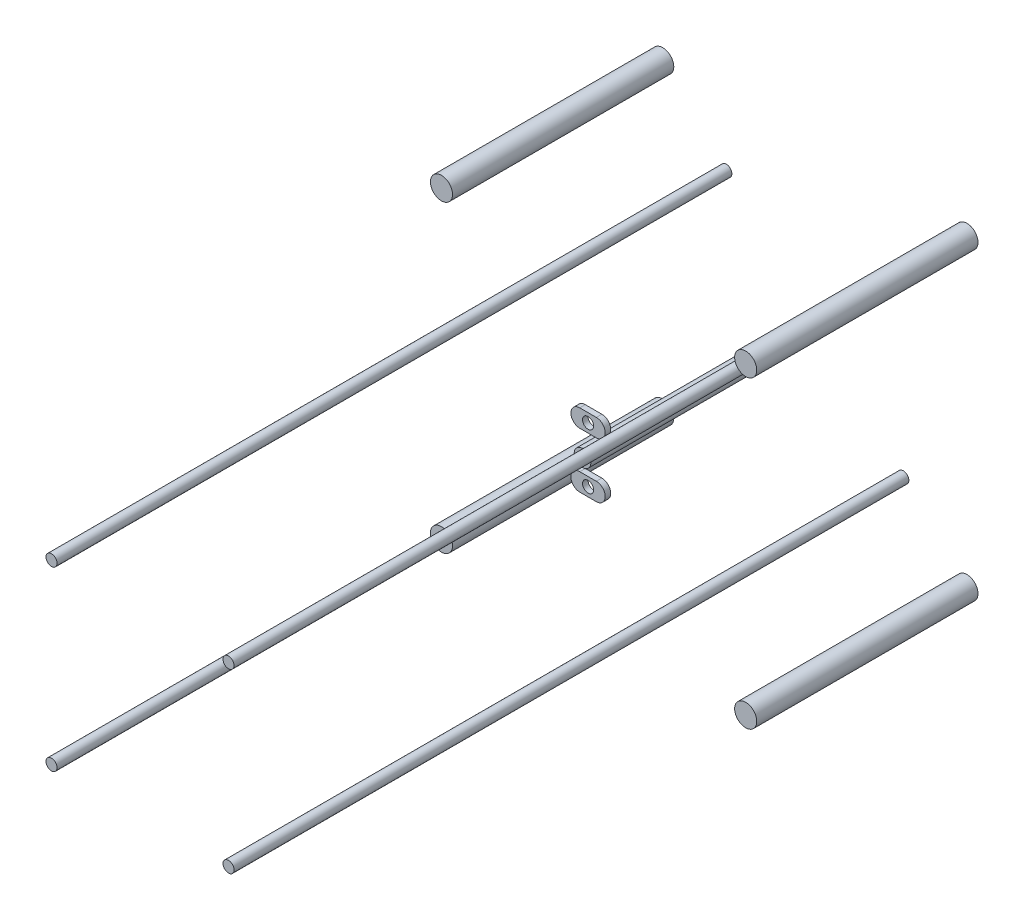
ISO-10303-21;
HEADER;
FILE_DESCRIPTION(('STEP AP214'),'2;1');
FILE_NAME('part.step','',(''),(''),'','','');
FILE_SCHEMA(('AUTOMOTIVE_DESIGN { 1 0 10303 214 1 1 1 1 }'));
ENDSEC;
DATA;
#1=APPLICATION_CONTEXT('core data for automotive mechanical design processes');
#2=APPLICATION_PROTOCOL_DEFINITION('international standard','automotive_design',2000,#1);
#3=PRODUCT_CONTEXT('',#1,'mechanical');
#4=PRODUCT('Part','Part','',(#3));
#5=PRODUCT_RELATED_PRODUCT_CATEGORY('part','',(#4));
#6=PRODUCT_DEFINITION_FORMATION('','',#4);
#7=PRODUCT_DEFINITION_CONTEXT('part definition',#1,'design');
#8=PRODUCT_DEFINITION('design','',#6,#7);
#9=PRODUCT_DEFINITION_SHAPE('','',#8);
#10=(LENGTH_UNIT() NAMED_UNIT(*) SI_UNIT(.MILLI.,.METRE.));
#11=(NAMED_UNIT(*) PLANE_ANGLE_UNIT() SI_UNIT($,.RADIAN.));
#12=(NAMED_UNIT(*) SI_UNIT($,.STERADIAN.) SOLID_ANGLE_UNIT());
#13=UNCERTAINTY_MEASURE_WITH_UNIT(LENGTH_MEASURE(1.E-05),#10,'distance_accuracy_value','');
#14=(GEOMETRIC_REPRESENTATION_CONTEXT(3) GLOBAL_UNCERTAINTY_ASSIGNED_CONTEXT((#13)) GLOBAL_UNIT_ASSIGNED_CONTEXT((#10,
#11,#12)) REPRESENTATION_CONTEXT('',''));
#15=CARTESIAN_POINT('',(0.,0.,0.));
#16=DIRECTION('',(0.,0.,1.));
#17=DIRECTION('',(1.,0.,0.));
#18=AXIS2_PLACEMENT_3D('',#15,#16,#17);
#19=CARTESIAN_POINT('',(-137.5,137.5,200.));
#20=DIRECTION('',(0.,0.,-1.));
#21=DIRECTION('',(-1.,0.,0.));
#22=AXIS2_PLACEMENT_3D('',#19,#20,#21);
#23=CYLINDRICAL_SURFACE('',#22,10.);
#24=CARTESIAN_POINT('',(-137.5,137.5,200.));
#25=DIRECTION('',(0.,0.,1.));
#26=DIRECTION('',(1.,0.,0.));
#27=AXIS2_PLACEMENT_3D('',#24,#25,#26);
#28=CIRCLE('',#27,10.);
#29=CARTESIAN_POINT('',(-127.5,137.5,200.));
#30=VERTEX_POINT('',#29);
#31=EDGE_CURVE('P0_E10',#30,#30,#28,.T.);
#32=ORIENTED_EDGE('',*,*,#31,.F.);
#33=EDGE_LOOP('',(#32));
#34=FACE_BOUND('',#33,.T.);
#35=CARTESIAN_POINT('',(-137.5,137.5,0.));
#36=DIRECTION('',(0.,0.,1.));
#37=DIRECTION('',(1.,0.,0.));
#38=AXIS2_PLACEMENT_3D('',#35,#36,#37);
#39=CIRCLE('',#38,10.);
#40=CARTESIAN_POINT('',(-127.5,137.5,0.));
#41=VERTEX_POINT('',#40);
#42=EDGE_CURVE('P0_E17',#41,#41,#39,.T.);
#43=ORIENTED_EDGE('',*,*,#42,.T.);
#44=EDGE_LOOP('',(#43));
#45=FACE_BOUND('',#44,.T.);
#46=ADVANCED_FACE('P0_F14',(#34,#45),#23,.T.);
#47=CARTESIAN_POINT('',(-137.5,137.5,200.));
#48=DIRECTION('',(0.,0.,1.));
#49=DIRECTION('',(1.,0.,0.));
#50=AXIS2_PLACEMENT_3D('',#47,#48,#49);
#51=PLANE('',#50);
#52=ORIENTED_EDGE('',*,*,#31,.T.);
#53=EDGE_LOOP('',(#52));
#54=FACE_BOUND('',#53,.T.);
#55=ADVANCED_FACE('P0_F29',(#54),#51,.T.);
#56=CARTESIAN_POINT('',(-137.5,137.5,0.));
#57=DIRECTION('',(0.,0.,1.));
#58=DIRECTION('',(1.,0.,0.));
#59=AXIS2_PLACEMENT_3D('',#56,#57,#58);
#60=PLANE('',#59);
#61=ORIENTED_EDGE('',*,*,#42,.F.);
#62=EDGE_LOOP('',(#61));
#63=FACE_BOUND('',#62,.T.);
#64=ADVANCED_FACE('P0_F27',(#63),#60,.F.);
#65=CLOSED_SHELL('',(#46,#55,#64));
#66=MANIFOLD_SOLID_BREP('P0_B1',#65);
#67=CARTESIAN_POINT('',(137.5,-137.5,200.));
#68=DIRECTION('',(0.,0.,-1.));
#69=DIRECTION('',(-1.,0.,0.));
#70=AXIS2_PLACEMENT_3D('',#67,#68,#69);
#71=CYLINDRICAL_SURFACE('',#70,10.);
#72=CARTESIAN_POINT('',(137.5,-137.5,200.));
#73=DIRECTION('',(0.,0.,1.));
#74=DIRECTION('',(1.,0.,0.));
#75=AXIS2_PLACEMENT_3D('',#72,#73,#74);
#76=CIRCLE('',#75,10.);
#77=CARTESIAN_POINT('',(147.5,-137.5,200.));
#78=VERTEX_POINT('',#77);
#79=EDGE_CURVE('P1_E10',#78,#78,#76,.T.);
#80=ORIENTED_EDGE('',*,*,#79,.F.);
#81=EDGE_LOOP('',(#80));
#82=FACE_BOUND('',#81,.T.);
#83=CARTESIAN_POINT('',(137.5,-137.5,0.));
#84=DIRECTION('',(0.,0.,1.));
#85=DIRECTION('',(1.,0.,0.));
#86=AXIS2_PLACEMENT_3D('',#83,#84,#85);
#87=CIRCLE('',#86,10.);
#88=CARTESIAN_POINT('',(147.5,-137.5,0.));
#89=VERTEX_POINT('',#88);
#90=EDGE_CURVE('P1_E17',#89,#89,#87,.T.);
#91=ORIENTED_EDGE('',*,*,#90,.T.);
#92=EDGE_LOOP('',(#91));
#93=FACE_BOUND('',#92,.T.);
#94=ADVANCED_FACE('P1_F14',(#82,#93),#71,.T.);
#95=CARTESIAN_POINT('',(137.5,-137.5,200.));
#96=DIRECTION('',(0.,0.,1.));
#97=DIRECTION('',(1.,0.,0.));
#98=AXIS2_PLACEMENT_3D('',#95,#96,#97);
#99=PLANE('',#98);
#100=ORIENTED_EDGE('',*,*,#79,.T.);
#101=EDGE_LOOP('',(#100));
#102=FACE_BOUND('',#101,.T.);
#103=ADVANCED_FACE('P1_F29',(#102),#99,.T.);
#104=CARTESIAN_POINT('',(137.5,-137.5,0.));
#105=DIRECTION('',(0.,0.,1.));
#106=DIRECTION('',(1.,0.,0.));
#107=AXIS2_PLACEMENT_3D('',#104,#105,#106);
#108=PLANE('',#107);
#109=ORIENTED_EDGE('',*,*,#90,.F.);
#110=EDGE_LOOP('',(#109));
#111=FACE_BOUND('',#110,.T.);
#112=ADVANCED_FACE('P1_F27',(#111),#108,.F.);
#113=CLOSED_SHELL('',(#94,#103,#112));
#114=MANIFOLD_SOLID_BREP('P1_B1',#113);
#115=CARTESIAN_POINT('',(-137.5,-137.5,200.));
#116=DIRECTION('',(0.,0.,-1.));
#117=DIRECTION('',(-1.,0.,0.));
#118=AXIS2_PLACEMENT_3D('',#115,#116,#117);
#119=CYLINDRICAL_SURFACE('',#118,10.);
#120=CARTESIAN_POINT('',(-137.5,-137.5,200.));
#121=DIRECTION('',(0.,0.,1.));
#122=DIRECTION('',(1.,0.,0.));
#123=AXIS2_PLACEMENT_3D('',#120,#121,#122);
#124=CIRCLE('',#123,10.);
#125=CARTESIAN_POINT('',(-127.5,-137.5,200.));
#126=VERTEX_POINT('',#125);
#127=EDGE_CURVE('P2_E10',#126,#126,#124,.T.);
#128=ORIENTED_EDGE('',*,*,#127,.F.);
#129=EDGE_LOOP('',(#128));
#130=FACE_BOUND('',#129,.T.);
#131=CARTESIAN_POINT('',(-137.5,-137.5,0.));
#132=DIRECTION('',(0.,0.,1.));
#133=DIRECTION('',(1.,0.,0.));
#134=AXIS2_PLACEMENT_3D('',#131,#132,#133);
#135=CIRCLE('',#134,10.);
#136=CARTESIAN_POINT('',(-127.5,-137.5,0.));
#137=VERTEX_POINT('',#136);
#138=EDGE_CURVE('P2_E17',#137,#137,#135,.T.);
#139=ORIENTED_EDGE('',*,*,#138,.T.);
#140=EDGE_LOOP('',(#139));
#141=FACE_BOUND('',#140,.T.);
#142=ADVANCED_FACE('P2_F14',(#130,#141),#119,.T.);
#143=CARTESIAN_POINT('',(-137.5,-137.5,200.));
#144=DIRECTION('',(0.,0.,1.));
#145=DIRECTION('',(1.,0.,0.));
#146=AXIS2_PLACEMENT_3D('',#143,#144,#145);
#147=PLANE('',#146);
#148=ORIENTED_EDGE('',*,*,#127,.T.);
#149=EDGE_LOOP('',(#148));
#150=FACE_BOUND('',#149,.T.);
#151=ADVANCED_FACE('P2_F29',(#150),#147,.T.);
#152=CARTESIAN_POINT('',(-137.5,-137.5,0.));
#153=DIRECTION('',(0.,0.,1.));
#154=DIRECTION('',(1.,0.,0.));
#155=AXIS2_PLACEMENT_3D('',#152,#153,#154);
#156=PLANE('',#155);
#157=ORIENTED_EDGE('',*,*,#138,.F.);
#158=EDGE_LOOP('',(#157));
#159=FACE_BOUND('',#158,.T.);
#160=ADVANCED_FACE('P2_F27',(#159),#156,.F.);
#161=CLOSED_SHELL('',(#142,#151,#160));
#162=MANIFOLD_SOLID_BREP('P2_B1',#161);
#163=CARTESIAN_POINT('',(137.5,137.5,200.));
#164=DIRECTION('',(0.,0.,-1.));
#165=DIRECTION('',(-1.,0.,0.));
#166=AXIS2_PLACEMENT_3D('',#163,#164,#165);
#167=CYLINDRICAL_SURFACE('',#166,10.);
#168=CARTESIAN_POINT('',(137.5,137.5,200.));
#169=DIRECTION('',(0.,0.,1.));
#170=DIRECTION('',(1.,0.,0.));
#171=AXIS2_PLACEMENT_3D('',#168,#169,#170);
#172=CIRCLE('',#171,10.);
#173=CARTESIAN_POINT('',(147.5,137.5,200.));
#174=VERTEX_POINT('',#173);
#175=EDGE_CURVE('P3_E10',#174,#174,#172,.T.);
#176=ORIENTED_EDGE('',*,*,#175,.F.);
#177=EDGE_LOOP('',(#176));
#178=FACE_BOUND('',#177,.T.);
#179=CARTESIAN_POINT('',(137.5,137.5,0.));
#180=DIRECTION('',(0.,0.,1.));
#181=DIRECTION('',(1.,0.,0.));
#182=AXIS2_PLACEMENT_3D('',#179,#180,#181);
#183=CIRCLE('',#182,10.);
#184=CARTESIAN_POINT('',(147.5,137.5,0.));
#185=VERTEX_POINT('',#184);
#186=EDGE_CURVE('P3_E17',#185,#185,#183,.T.);
#187=ORIENTED_EDGE('',*,*,#186,.T.);
#188=EDGE_LOOP('',(#187));
#189=FACE_BOUND('',#188,.T.);
#190=ADVANCED_FACE('P3_F14',(#178,#189),#167,.T.);
#191=CARTESIAN_POINT('',(137.5,137.5,200.));
#192=DIRECTION('',(0.,0.,1.));
#193=DIRECTION('',(1.,0.,0.));
#194=AXIS2_PLACEMENT_3D('',#191,#192,#193);
#195=PLANE('',#194);
#196=ORIENTED_EDGE('',*,*,#175,.T.);
#197=EDGE_LOOP('',(#196));
#198=FACE_BOUND('',#197,.T.);
#199=ADVANCED_FACE('P3_F29',(#198),#195,.T.);
#200=CARTESIAN_POINT('',(137.5,137.5,0.));
#201=DIRECTION('',(0.,0.,1.));
#202=DIRECTION('',(1.,0.,0.));
#203=AXIS2_PLACEMENT_3D('',#200,#201,#202);
#204=PLANE('',#203);
#205=ORIENTED_EDGE('',*,*,#186,.F.);
#206=EDGE_LOOP('',(#205));
#207=FACE_BOUND('',#206,.T.);
#208=ADVANCED_FACE('P3_F27',(#207),#204,.F.);
#209=CLOSED_SHELL('',(#190,#199,#208));
#210=MANIFOLD_SOLID_BREP('P3_B1',#209);
#211=CARTESIAN_POINT('',(0.,0.,210.));
#212=DIRECTION('',(0.,0.,-1.));
#213=DIRECTION('',(-1.,0.,0.));
#214=AXIS2_PLACEMENT_3D('',#211,#212,#213);
#215=CYLINDRICAL_SURFACE('',#214,7.5);
#216=CARTESIAN_POINT('',(0.,0.,210.));
#217=DIRECTION('',(0.,0.,1.));
#218=DIRECTION('',(1.,0.,0.));
#219=AXIS2_PLACEMENT_3D('',#216,#217,#218);
#220=CIRCLE('',#219,7.5);
#221=CARTESIAN_POINT('',(7.5,0.,210.));
#222=VERTEX_POINT('',#221);
#223=EDGE_CURVE('P4_E10',#222,#222,#220,.T.);
#224=ORIENTED_EDGE('',*,*,#223,.F.);
#225=EDGE_LOOP('',(#224));
#226=FACE_BOUND('',#225,.T.);
#227=CARTESIAN_POINT('',(0.,0.,9.99999999999997));
#228=DIRECTION('',(0.,0.,1.));
#229=DIRECTION('',(1.,0.,0.));
#230=AXIS2_PLACEMENT_3D('',#227,#228,#229);
#231=CIRCLE('',#230,7.5);
#232=CARTESIAN_POINT('',(7.5,0.,9.99999999999997));
#233=VERTEX_POINT('',#232);
#234=EDGE_CURVE('P4_E17',#233,#233,#231,.T.);
#235=ORIENTED_EDGE('',*,*,#234,.T.);
#236=EDGE_LOOP('',(#235));
#237=FACE_BOUND('',#236,.T.);
#238=ADVANCED_FACE('P4_F14',(#226,#237),#215,.T.);
#239=CARTESIAN_POINT('',(0.,0.,210.));
#240=DIRECTION('',(0.,0.,1.));
#241=DIRECTION('',(1.,0.,0.));
#242=AXIS2_PLACEMENT_3D('',#239,#240,#241);
#243=PLANE('',#242);
#244=ORIENTED_EDGE('',*,*,#223,.T.);
#245=EDGE_LOOP('',(#244));
#246=FACE_BOUND('',#245,.T.);
#247=ADVANCED_FACE('P4_F29',(#246),#243,.T.);
#248=CARTESIAN_POINT('',(0.,0.,9.99999999999997));
#249=DIRECTION('',(0.,0.,1.));
#250=DIRECTION('',(1.,0.,0.));
#251=AXIS2_PLACEMENT_3D('',#248,#249,#250);
#252=PLANE('',#251);
#253=ORIENTED_EDGE('',*,*,#234,.F.);
#254=EDGE_LOOP('',(#253));
#255=FACE_BOUND('',#254,.T.);
#256=ADVANCED_FACE('P4_F27',(#255),#252,.F.);
#257=CLOSED_SHELL('',(#238,#247,#256));
#258=MANIFOLD_SOLID_BREP('P4_B1',#257);
#259=CARTESIAN_POINT('',(80.,-80.,610.));
#260=DIRECTION('',(0.,0.,-1.));
#261=DIRECTION('',(-1.,0.,0.));
#262=AXIS2_PLACEMENT_3D('',#259,#260,#261);
#263=CYLINDRICAL_SURFACE('',#262,5.);
#264=CARTESIAN_POINT('',(80.,-80.,610.));
#265=DIRECTION('',(0.,0.,1.));
#266=DIRECTION('',(1.,0.,0.));
#267=AXIS2_PLACEMENT_3D('',#264,#265,#266);
#268=CIRCLE('',#267,5.);
#269=CARTESIAN_POINT('',(85.,-80.,610.));
#270=VERTEX_POINT('',#269);
#271=EDGE_CURVE('P5_E10',#270,#270,#268,.T.);
#272=ORIENTED_EDGE('',*,*,#271,.F.);
#273=EDGE_LOOP('',(#272));
#274=FACE_BOUND('',#273,.T.);
#275=CARTESIAN_POINT('',(80.,-80.,0.));
#276=DIRECTION('',(0.,0.,1.));
#277=DIRECTION('',(1.,0.,0.));
#278=AXIS2_PLACEMENT_3D('',#275,#276,#277);
#279=CIRCLE('',#278,5.);
#280=CARTESIAN_POINT('',(85.,-80.,0.));
#281=VERTEX_POINT('',#280);
#282=EDGE_CURVE('P5_E17',#281,#281,#279,.T.);
#283=ORIENTED_EDGE('',*,*,#282,.T.);
#284=EDGE_LOOP('',(#283));
#285=FACE_BOUND('',#284,.T.);
#286=ADVANCED_FACE('P5_F14',(#274,#285),#263,.T.);
#287=CARTESIAN_POINT('',(80.,-80.,610.));
#288=DIRECTION('',(0.,0.,1.));
#289=DIRECTION('',(1.,0.,0.));
#290=AXIS2_PLACEMENT_3D('',#287,#288,#289);
#291=PLANE('',#290);
#292=ORIENTED_EDGE('',*,*,#271,.T.);
#293=EDGE_LOOP('',(#292));
#294=FACE_BOUND('',#293,.T.);
#295=ADVANCED_FACE('P5_F29',(#294),#291,.T.);
#296=CARTESIAN_POINT('',(80.,-80.,0.));
#297=DIRECTION('',(0.,0.,1.));
#298=DIRECTION('',(1.,0.,0.));
#299=AXIS2_PLACEMENT_3D('',#296,#297,#298);
#300=PLANE('',#299);
#301=ORIENTED_EDGE('',*,*,#282,.F.);
#302=EDGE_LOOP('',(#301));
#303=FACE_BOUND('',#302,.T.);
#304=ADVANCED_FACE('P5_F27',(#303),#300,.F.);
#305=CLOSED_SHELL('',(#286,#295,#304));
#306=MANIFOLD_SOLID_BREP('P5_B1',#305);
#307=CARTESIAN_POINT('',(80.,80.,610.));
#308=DIRECTION('',(0.,0.,-1.));
#309=DIRECTION('',(-1.,0.,0.));
#310=AXIS2_PLACEMENT_3D('',#307,#308,#309);
#311=CYLINDRICAL_SURFACE('',#310,5.);
#312=CARTESIAN_POINT('',(80.,80.,610.));
#313=DIRECTION('',(0.,0.,1.));
#314=DIRECTION('',(1.,0.,0.));
#315=AXIS2_PLACEMENT_3D('',#312,#313,#314);
#316=CIRCLE('',#315,5.);
#317=CARTESIAN_POINT('',(85.,80.,610.));
#318=VERTEX_POINT('',#317);
#319=EDGE_CURVE('P6_E10',#318,#318,#316,.T.);
#320=ORIENTED_EDGE('',*,*,#319,.F.);
#321=EDGE_LOOP('',(#320));
#322=FACE_BOUND('',#321,.T.);
#323=CARTESIAN_POINT('',(80.,80.,0.));
#324=DIRECTION('',(0.,0.,1.));
#325=DIRECTION('',(1.,0.,0.));
#326=AXIS2_PLACEMENT_3D('',#323,#324,#325);
#327=CIRCLE('',#326,5.);
#328=CARTESIAN_POINT('',(85.,80.,0.));
#329=VERTEX_POINT('',#328);
#330=EDGE_CURVE('P6_E17',#329,#329,#327,.T.);
#331=ORIENTED_EDGE('',*,*,#330,.T.);
#332=EDGE_LOOP('',(#331));
#333=FACE_BOUND('',#332,.T.);
#334=ADVANCED_FACE('P6_F14',(#322,#333),#311,.T.);
#335=CARTESIAN_POINT('',(80.,80.,610.));
#336=DIRECTION('',(0.,0.,1.));
#337=DIRECTION('',(1.,0.,0.));
#338=AXIS2_PLACEMENT_3D('',#335,#336,#337);
#339=PLANE('',#338);
#340=ORIENTED_EDGE('',*,*,#319,.T.);
#341=EDGE_LOOP('',(#340));
#342=FACE_BOUND('',#341,.T.);
#343=ADVANCED_FACE('P6_F29',(#342),#339,.T.);
#344=CARTESIAN_POINT('',(80.,80.,0.));
#345=DIRECTION('',(0.,0.,1.));
#346=DIRECTION('',(1.,0.,0.));
#347=AXIS2_PLACEMENT_3D('',#344,#345,#346);
#348=PLANE('',#347);
#349=ORIENTED_EDGE('',*,*,#330,.F.);
#350=EDGE_LOOP('',(#349));
#351=FACE_BOUND('',#350,.T.);
#352=ADVANCED_FACE('P6_F27',(#351),#348,.F.);
#353=CLOSED_SHELL('',(#334,#343,#352));
#354=MANIFOLD_SOLID_BREP('P6_B1',#353);
#355=CARTESIAN_POINT('',(-80.,-80.,610.));
#356=DIRECTION('',(0.,0.,-1.));
#357=DIRECTION('',(-1.,0.,0.));
#358=AXIS2_PLACEMENT_3D('',#355,#356,#357);
#359=CYLINDRICAL_SURFACE('',#358,5.);
#360=CARTESIAN_POINT('',(-80.,-80.,610.));
#361=DIRECTION('',(0.,0.,1.));
#362=DIRECTION('',(1.,0.,0.));
#363=AXIS2_PLACEMENT_3D('',#360,#361,#362);
#364=CIRCLE('',#363,5.);
#365=CARTESIAN_POINT('',(-75.,-80.,610.));
#366=VERTEX_POINT('',#365);
#367=EDGE_CURVE('P7_E10',#366,#366,#364,.T.);
#368=ORIENTED_EDGE('',*,*,#367,.F.);
#369=EDGE_LOOP('',(#368));
#370=FACE_BOUND('',#369,.T.);
#371=CARTESIAN_POINT('',(-80.,-80.,0.));
#372=DIRECTION('',(0.,0.,1.));
#373=DIRECTION('',(1.,0.,0.));
#374=AXIS2_PLACEMENT_3D('',#371,#372,#373);
#375=CIRCLE('',#374,5.);
#376=CARTESIAN_POINT('',(-75.,-80.,0.));
#377=VERTEX_POINT('',#376);
#378=EDGE_CURVE('P7_E17',#377,#377,#375,.T.);
#379=ORIENTED_EDGE('',*,*,#378,.T.);
#380=EDGE_LOOP('',(#379));
#381=FACE_BOUND('',#380,.T.);
#382=ADVANCED_FACE('P7_F14',(#370,#381),#359,.T.);
#383=CARTESIAN_POINT('',(-80.,-80.,610.));
#384=DIRECTION('',(0.,0.,1.));
#385=DIRECTION('',(1.,0.,0.));
#386=AXIS2_PLACEMENT_3D('',#383,#384,#385);
#387=PLANE('',#386);
#388=ORIENTED_EDGE('',*,*,#367,.T.);
#389=EDGE_LOOP('',(#388));
#390=FACE_BOUND('',#389,.T.);
#391=ADVANCED_FACE('P7_F29',(#390),#387,.T.);
#392=CARTESIAN_POINT('',(-80.,-80.,0.));
#393=DIRECTION('',(0.,0.,1.));
#394=DIRECTION('',(1.,0.,0.));
#395=AXIS2_PLACEMENT_3D('',#392,#393,#394);
#396=PLANE('',#395);
#397=ORIENTED_EDGE('',*,*,#378,.F.);
#398=EDGE_LOOP('',(#397));
#399=FACE_BOUND('',#398,.T.);
#400=ADVANCED_FACE('P7_F27',(#399),#396,.F.);
#401=CLOSED_SHELL('',(#382,#391,#400));
#402=MANIFOLD_SOLID_BREP('P7_B1',#401);
#403=CARTESIAN_POINT('',(-80.,80.,610.));
#404=DIRECTION('',(0.,0.,-1.));
#405=DIRECTION('',(-1.,0.,0.));
#406=AXIS2_PLACEMENT_3D('',#403,#404,#405);
#407=CYLINDRICAL_SURFACE('',#406,5.);
#408=CARTESIAN_POINT('',(-80.,80.,610.));
#409=DIRECTION('',(0.,0.,1.));
#410=DIRECTION('',(1.,0.,0.));
#411=AXIS2_PLACEMENT_3D('',#408,#409,#410);
#412=CIRCLE('',#411,5.);
#413=CARTESIAN_POINT('',(-75.,80.,610.));
#414=VERTEX_POINT('',#413);
#415=EDGE_CURVE('P8_E10',#414,#414,#412,.T.);
#416=ORIENTED_EDGE('',*,*,#415,.F.);
#417=EDGE_LOOP('',(#416));
#418=FACE_BOUND('',#417,.T.);
#419=CARTESIAN_POINT('',(-80.,80.,0.));
#420=DIRECTION('',(0.,0.,1.));
#421=DIRECTION('',(1.,0.,0.));
#422=AXIS2_PLACEMENT_3D('',#419,#420,#421);
#423=CIRCLE('',#422,5.);
#424=CARTESIAN_POINT('',(-75.,80.,0.));
#425=VERTEX_POINT('',#424);
#426=EDGE_CURVE('P8_E17',#425,#425,#423,.T.);
#427=ORIENTED_EDGE('',*,*,#426,.T.);
#428=EDGE_LOOP('',(#427));
#429=FACE_BOUND('',#428,.T.);
#430=ADVANCED_FACE('P8_F14',(#418,#429),#407,.T.);
#431=CARTESIAN_POINT('',(-80.,80.,610.));
#432=DIRECTION('',(0.,0.,1.));
#433=DIRECTION('',(1.,0.,0.));
#434=AXIS2_PLACEMENT_3D('',#431,#432,#433);
#435=PLANE('',#434);
#436=ORIENTED_EDGE('',*,*,#415,.T.);
#437=EDGE_LOOP('',(#436));
#438=FACE_BOUND('',#437,.T.);
#439=ADVANCED_FACE('P8_F29',(#438),#435,.T.);
#440=CARTESIAN_POINT('',(-80.,80.,0.));
#441=DIRECTION('',(0.,0.,1.));
#442=DIRECTION('',(1.,0.,0.));
#443=AXIS2_PLACEMENT_3D('',#440,#441,#442);
#444=PLANE('',#443);
#445=ORIENTED_EDGE('',*,*,#426,.F.);
#446=EDGE_LOOP('',(#445));
#447=FACE_BOUND('',#446,.T.);
#448=ADVANCED_FACE('P8_F27',(#447),#444,.F.);
#449=CLOSED_SHELL('',(#430,#439,#448));
#450=MANIFOLD_SOLID_BREP('P8_B1',#449);
#451=CARTESIAN_POINT('',(7.5,25.,205.));
#452=DIRECTION('',(0.,0.,-1.));
#453=DIRECTION('',(0.,-1.,0.));
#454=AXIS2_PLACEMENT_3D('',#451,#452,#453);
#455=CYLINDRICAL_SURFACE('',#454,8.);
#456=CARTESIAN_POINT('',(7.5,25.,200.));
#457=DIRECTION('',(0.,0.,1.));
#458=DIRECTION('',(0.,1.,0.));
#459=AXIS2_PLACEMENT_3D('',#456,#457,#458);
#460=CIRCLE('',#459,8.);
#461=CARTESIAN_POINT('',(7.5,17.,200.));
#462=VERTEX_POINT('',#461);
#463=CARTESIAN_POINT('',(7.5,33.,200.));
#464=VERTEX_POINT('',#463);
#465=EDGE_CURVE('P9_E81',#462,#464,#460,.T.);
#466=ORIENTED_EDGE('',*,*,#465,.T.);
#467=DIRECTION('',(0.,0.,-1.));
#468=VECTOR('',#467,1.);
#469=CARTESIAN_POINT('',(7.5,33.,205.));
#470=LINE('',#469,#468);
#471=CARTESIAN_POINT('',(7.5,33.,205.));
#472=VERTEX_POINT('',#471);
#473=EDGE_CURVE('P9_E11',#472,#464,#470,.T.);
#474=ORIENTED_EDGE('',*,*,#473,.F.);
#475=CARTESIAN_POINT('',(7.5,25.,205.));
#476=DIRECTION('',(0.,0.,1.));
#477=DIRECTION('',(0.,1.,0.));
#478=AXIS2_PLACEMENT_3D('',#475,#476,#477);
#479=CIRCLE('',#478,8.);
#480=CARTESIAN_POINT('',(7.5,17.,205.));
#481=VERTEX_POINT('',#480);
#482=EDGE_CURVE('P9_E68',#481,#472,#479,.T.);
#483=ORIENTED_EDGE('',*,*,#482,.F.);
#484=DIRECTION('',(0.,0.,-1.));
#485=VECTOR('',#484,1.);
#486=CARTESIAN_POINT('',(7.5,17.,205.));
#487=LINE('',#486,#485);
#488=EDGE_CURVE('P9_E77',#481,#462,#487,.T.);
#489=ORIENTED_EDGE('',*,*,#488,.T.);
#490=EDGE_LOOP('',(#466,#474,#483,#489));
#491=FACE_BOUND('',#490,.T.);
#492=ADVANCED_FACE('P9_F16',(#491),#455,.T.);
#493=CARTESIAN_POINT('',(7.5,33.,205.));
#494=DIRECTION('',(0.,-1.,0.));
#495=DIRECTION('',(1.,0.,0.));
#496=AXIS2_PLACEMENT_3D('',#493,#494,#495);
#497=PLANE('',#496);
#498=DIRECTION('',(-1.,0.,0.));
#499=VECTOR('',#498,1.);
#500=CARTESIAN_POINT('',(7.5,33.,200.));
#501=LINE('',#500,#499);
#502=CARTESIAN_POINT('',(-7.5,33.,200.));
#503=VERTEX_POINT('',#502);
#504=EDGE_CURVE('P9_E72',#464,#503,#501,.T.);
#505=ORIENTED_EDGE('',*,*,#504,.T.);
#506=DIRECTION('',(0.,0.,-1.));
#507=VECTOR('',#506,1.);
#508=CARTESIAN_POINT('',(-7.5,33.,205.));
#509=LINE('',#508,#507);
#510=CARTESIAN_POINT('',(-7.5,33.,205.));
#511=VERTEX_POINT('',#510);
#512=EDGE_CURVE('P9_E25',#511,#503,#509,.T.);
#513=ORIENTED_EDGE('',*,*,#512,.F.);
#514=DIRECTION('',(-1.,0.,0.));
#515=VECTOR('',#514,1.);
#516=CARTESIAN_POINT('',(7.5,33.,205.));
#517=LINE('',#516,#515);
#518=EDGE_CURVE('P9_E63',#472,#511,#517,.T.);
#519=ORIENTED_EDGE('',*,*,#518,.F.);
#520=ORIENTED_EDGE('',*,*,#473,.T.);
#521=EDGE_LOOP('',(#505,#513,#519,#520));
#522=FACE_BOUND('',#521,.T.);
#523=ADVANCED_FACE('P9_F71',(#522),#497,.F.);
#524=CARTESIAN_POINT('',(-7.5,25.,205.));
#525=DIRECTION('',(0.,0.,-1.));
#526=DIRECTION('',(0.,-1.,0.));
#527=AXIS2_PLACEMENT_3D('',#524,#525,#526);
#528=CYLINDRICAL_SURFACE('',#527,8.);
#529=CARTESIAN_POINT('',(-7.5,25.,200.));
#530=DIRECTION('',(0.,0.,1.));
#531=DIRECTION('',(0.,1.,0.));
#532=AXIS2_PLACEMENT_3D('',#529,#530,#531);
#533=CIRCLE('',#532,8.);
#534=CARTESIAN_POINT('',(-7.5,17.,200.));
#535=VERTEX_POINT('',#534);
#536=EDGE_CURVE('P9_E50',#503,#535,#533,.T.);
#537=ORIENTED_EDGE('',*,*,#536,.T.);
#538=DIRECTION('',(0.,0.,-1.));
#539=VECTOR('',#538,1.);
#540=CARTESIAN_POINT('',(-7.5,17.,205.));
#541=LINE('',#540,#539);
#542=CARTESIAN_POINT('',(-7.5,17.,205.));
#543=VERTEX_POINT('',#542);
#544=EDGE_CURVE('P9_E73',#543,#535,#541,.T.);
#545=ORIENTED_EDGE('',*,*,#544,.F.);
#546=CARTESIAN_POINT('',(-7.5,25.,205.));
#547=DIRECTION('',(0.,0.,1.));
#548=DIRECTION('',(0.,1.,0.));
#549=AXIS2_PLACEMENT_3D('',#546,#547,#548);
#550=CIRCLE('',#549,8.);
#551=EDGE_CURVE('P9_E66',#511,#543,#550,.T.);
#552=ORIENTED_EDGE('',*,*,#551,.F.);
#553=ORIENTED_EDGE('',*,*,#512,.T.);
#554=EDGE_LOOP('',(#537,#545,#552,#553));
#555=FACE_BOUND('',#554,.T.);
#556=ADVANCED_FACE('P9_F75',(#555),#528,.T.);
#557=CARTESIAN_POINT('',(7.5,17.,205.));
#558=DIRECTION('',(0.,1.,0.));
#559=DIRECTION('',(-1.,0.,0.));
#560=AXIS2_PLACEMENT_3D('',#557,#558,#559);
#561=PLANE('',#560);
#562=DIRECTION('',(1.,0.,0.));
#563=VECTOR('',#562,1.);
#564=CARTESIAN_POINT('',(7.5,17.,200.));
#565=LINE('',#564,#563);
#566=EDGE_CURVE('P9_E56',#535,#462,#565,.T.);
#567=ORIENTED_EDGE('',*,*,#566,.T.);
#568=ORIENTED_EDGE('',*,*,#488,.F.);
#569=DIRECTION('',(1.,0.,0.));
#570=VECTOR('',#569,1.);
#571=CARTESIAN_POINT('',(7.5,17.,205.));
#572=LINE('',#571,#570);
#573=EDGE_CURVE('P9_E33',#543,#481,#572,.T.);
#574=ORIENTED_EDGE('',*,*,#573,.F.);
#575=ORIENTED_EDGE('',*,*,#544,.T.);
#576=EDGE_LOOP('',(#567,#568,#574,#575));
#577=FACE_BOUND('',#576,.T.);
#578=ADVANCED_FACE('P9_F88',(#577),#561,.F.);
#579=CARTESIAN_POINT('',(7.5,25.,205.));
#580=DIRECTION('',(0.,0.,1.));
#581=DIRECTION('',(0.,1.,0.));
#582=AXIS2_PLACEMENT_3D('',#579,#580,#581);
#583=PLANE('',#582);
#584=CARTESIAN_POINT('',(0.,25.,205.));
#585=DIRECTION('',(0.,0.,1.));
#586=DIRECTION('',(0.,1.,0.));
#587=AXIS2_PLACEMENT_3D('',#584,#585,#586);
#588=CIRCLE('',#587,5.);
#589=CARTESIAN_POINT('',(0.,30.,205.));
#590=VERTEX_POINT('',#589);
#591=EDGE_CURVE('P9_E94',#590,#590,#588,.T.);
#592=ORIENTED_EDGE('',*,*,#591,.F.);
#593=EDGE_LOOP('',(#592));
#594=FACE_BOUND('',#593,.T.);
#595=ORIENTED_EDGE('',*,*,#482,.T.);
#596=ORIENTED_EDGE('',*,*,#518,.T.);
#597=ORIENTED_EDGE('',*,*,#551,.T.);
#598=ORIENTED_EDGE('',*,*,#573,.T.);
#599=EDGE_LOOP('',(#595,#596,#597,#598));
#600=FACE_BOUND('',#599,.T.);
#601=ADVANCED_FACE('P9_F64',(#594,#600),#583,.T.);
#602=CARTESIAN_POINT('',(7.5,25.,200.));
#603=DIRECTION('',(0.,0.,1.));
#604=DIRECTION('',(0.,1.,0.));
#605=AXIS2_PLACEMENT_3D('',#602,#603,#604);
#606=PLANE('',#605);
#607=CARTESIAN_POINT('',(0.,25.,200.));
#608=DIRECTION('',(0.,0.,1.));
#609=DIRECTION('',(0.,1.,0.));
#610=AXIS2_PLACEMENT_3D('',#607,#608,#609);
#611=CIRCLE('',#610,5.);
#612=CARTESIAN_POINT('',(0.,30.,200.));
#613=VERTEX_POINT('',#612);
#614=EDGE_CURVE('P9_E19',#613,#613,#611,.T.);
#615=ORIENTED_EDGE('',*,*,#614,.T.);
#616=EDGE_LOOP('',(#615));
#617=FACE_BOUND('',#616,.T.);
#618=ORIENTED_EDGE('',*,*,#465,.F.);
#619=ORIENTED_EDGE('',*,*,#566,.F.);
#620=ORIENTED_EDGE('',*,*,#536,.F.);
#621=ORIENTED_EDGE('',*,*,#504,.F.);
#622=EDGE_LOOP('',(#618,#619,#620,#621));
#623=FACE_BOUND('',#622,.T.);
#624=ADVANCED_FACE('P9_F91',(#617,#623),#606,.F.);
#625=CARTESIAN_POINT('',(0.,25.,195.));
#626=DIRECTION('',(0.,0.,1.));
#627=DIRECTION('',(0.,1.,0.));
#628=AXIS2_PLACEMENT_3D('',#625,#626,#627);
#629=CYLINDRICAL_SURFACE('',#628,5.);
#630=ORIENTED_EDGE('',*,*,#591,.T.);
#631=EDGE_LOOP('',(#630));
#632=FACE_BOUND('',#631,.T.);
#633=ORIENTED_EDGE('',*,*,#614,.F.);
#634=EDGE_LOOP('',(#633));
#635=FACE_BOUND('',#634,.T.);
#636=ADVANCED_FACE('P9_F102',(#632,#635),#629,.F.);
#637=CLOSED_SHELL('',(#492,#523,#556,#578,#601,#624,#636));
#638=MANIFOLD_SOLID_BREP('P9_B1',#637);
#639=CARTESIAN_POINT('',(-7.49999999999999,-25.,205.));
#640=DIRECTION('',(0.,0.,-1.));
#641=DIRECTION('',(0.,1.,0.));
#642=AXIS2_PLACEMENT_3D('',#639,#640,#641);
#643=CYLINDRICAL_SURFACE('',#642,8.);
#644=CARTESIAN_POINT('',(-7.49999999999999,-25.,200.));
#645=DIRECTION('',(0.,0.,1.));
#646=DIRECTION('',(0.,-1.,0.));
#647=AXIS2_PLACEMENT_3D('',#644,#645,#646);
#648=CIRCLE('',#647,8.);
#649=CARTESIAN_POINT('',(-7.49999999999999,-17.,200.));
#650=VERTEX_POINT('',#649);
#651=CARTESIAN_POINT('',(-7.5,-33.,200.));
#652=VERTEX_POINT('',#651);
#653=EDGE_CURVE('P10_E81',#650,#652,#648,.T.);
#654=ORIENTED_EDGE('',*,*,#653,.T.);
#655=DIRECTION('',(0.,0.,-1.));
#656=VECTOR('',#655,1.);
#657=CARTESIAN_POINT('',(-7.5,-33.,205.));
#658=LINE('',#657,#656);
#659=CARTESIAN_POINT('',(-7.5,-33.,205.));
#660=VERTEX_POINT('',#659);
#661=EDGE_CURVE('P10_E11',#660,#652,#658,.T.);
#662=ORIENTED_EDGE('',*,*,#661,.F.);
#663=CARTESIAN_POINT('',(-7.49999999999999,-25.,205.));
#664=DIRECTION('',(0.,0.,1.));
#665=DIRECTION('',(0.,-1.,0.));
#666=AXIS2_PLACEMENT_3D('',#663,#664,#665);
#667=CIRCLE('',#666,8.);
#668=CARTESIAN_POINT('',(-7.49999999999999,-17.,205.));
#669=VERTEX_POINT('',#668);
#670=EDGE_CURVE('P10_E68',#669,#660,#667,.T.);
#671=ORIENTED_EDGE('',*,*,#670,.F.);
#672=DIRECTION('',(0.,0.,-1.));
#673=VECTOR('',#672,1.);
#674=CARTESIAN_POINT('',(-7.49999999999999,-17.,205.));
#675=LINE('',#674,#673);
#676=EDGE_CURVE('P10_E77',#669,#650,#675,.T.);
#677=ORIENTED_EDGE('',*,*,#676,.T.);
#678=EDGE_LOOP('',(#654,#662,#671,#677));
#679=FACE_BOUND('',#678,.T.);
#680=ADVANCED_FACE('P10_F16',(#679),#643,.T.);
#681=CARTESIAN_POINT('',(-7.5,-33.,205.));
#682=DIRECTION('',(0.,1.,0.));
#683=DIRECTION('',(-1.,0.,0.));
#684=AXIS2_PLACEMENT_3D('',#681,#682,#683);
#685=PLANE('',#684);
#686=DIRECTION('',(1.,0.,0.));
#687=VECTOR('',#686,1.);
#688=CARTESIAN_POINT('',(-7.5,-33.,200.));
#689=LINE('',#688,#687);
#690=CARTESIAN_POINT('',(7.50000000000001,-33.,200.));
#691=VERTEX_POINT('',#690);
#692=EDGE_CURVE('P10_E72',#652,#691,#689,.T.);
#693=ORIENTED_EDGE('',*,*,#692,.T.);
#694=DIRECTION('',(0.,0.,-1.));
#695=VECTOR('',#694,1.);
#696=CARTESIAN_POINT('',(7.50000000000001,-33.,205.));
#697=LINE('',#696,#695);
#698=CARTESIAN_POINT('',(7.50000000000001,-33.,205.));
#699=VERTEX_POINT('',#698);
#700=EDGE_CURVE('P10_E25',#699,#691,#697,.T.);
#701=ORIENTED_EDGE('',*,*,#700,.F.);
#702=DIRECTION('',(1.,0.,0.));
#703=VECTOR('',#702,1.);
#704=CARTESIAN_POINT('',(-7.5,-33.,205.));
#705=LINE('',#704,#703);
#706=EDGE_CURVE('P10_E63',#660,#699,#705,.T.);
#707=ORIENTED_EDGE('',*,*,#706,.F.);
#708=ORIENTED_EDGE('',*,*,#661,.T.);
#709=EDGE_LOOP('',(#693,#701,#707,#708));
#710=FACE_BOUND('',#709,.T.);
#711=ADVANCED_FACE('P10_F71',(#710),#685,.F.);
#712=CARTESIAN_POINT('',(7.50000000000001,-25.,205.));
#713=DIRECTION('',(0.,0.,-1.));
#714=DIRECTION('',(0.,1.,0.));
#715=AXIS2_PLACEMENT_3D('',#712,#713,#714);
#716=CYLINDRICAL_SURFACE('',#715,8.);
#717=CARTESIAN_POINT('',(7.50000000000001,-25.,200.));
#718=DIRECTION('',(0.,0.,1.));
#719=DIRECTION('',(0.,-1.,0.));
#720=AXIS2_PLACEMENT_3D('',#717,#718,#719);
#721=CIRCLE('',#720,8.);
#722=CARTESIAN_POINT('',(7.5,-17.,200.));
#723=VERTEX_POINT('',#722);
#724=EDGE_CURVE('P10_E50',#691,#723,#721,.T.);
#725=ORIENTED_EDGE('',*,*,#724,.T.);
#726=DIRECTION('',(0.,0.,-1.));
#727=VECTOR('',#726,1.);
#728=CARTESIAN_POINT('',(7.5,-17.,205.));
#729=LINE('',#728,#727);
#730=CARTESIAN_POINT('',(7.5,-17.,205.));
#731=VERTEX_POINT('',#730);
#732=EDGE_CURVE('P10_E73',#731,#723,#729,.T.);
#733=ORIENTED_EDGE('',*,*,#732,.F.);
#734=CARTESIAN_POINT('',(7.50000000000001,-25.,205.));
#735=DIRECTION('',(0.,0.,1.));
#736=DIRECTION('',(0.,-1.,0.));
#737=AXIS2_PLACEMENT_3D('',#734,#735,#736);
#738=CIRCLE('',#737,8.);
#739=EDGE_CURVE('P10_E66',#699,#731,#738,.T.);
#740=ORIENTED_EDGE('',*,*,#739,.F.);
#741=ORIENTED_EDGE('',*,*,#700,.T.);
#742=EDGE_LOOP('',(#725,#733,#740,#741));
#743=FACE_BOUND('',#742,.T.);
#744=ADVANCED_FACE('P10_F75',(#743),#716,.T.);
#745=CARTESIAN_POINT('',(-7.49999999999999,-17.,205.));
#746=DIRECTION('',(0.,-1.,0.));
#747=DIRECTION('',(1.,0.,0.));
#748=AXIS2_PLACEMENT_3D('',#745,#746,#747);
#749=PLANE('',#748);
#750=DIRECTION('',(-1.,0.,0.));
#751=VECTOR('',#750,1.);
#752=CARTESIAN_POINT('',(-7.49999999999999,-17.,200.));
#753=LINE('',#752,#751);
#754=EDGE_CURVE('P10_E56',#723,#650,#753,.T.);
#755=ORIENTED_EDGE('',*,*,#754,.T.);
#756=ORIENTED_EDGE('',*,*,#676,.F.);
#757=DIRECTION('',(-1.,0.,0.));
#758=VECTOR('',#757,1.);
#759=CARTESIAN_POINT('',(-7.49999999999999,-17.,205.));
#760=LINE('',#759,#758);
#761=EDGE_CURVE('P10_E33',#731,#669,#760,.T.);
#762=ORIENTED_EDGE('',*,*,#761,.F.);
#763=ORIENTED_EDGE('',*,*,#732,.T.);
#764=EDGE_LOOP('',(#755,#756,#762,#763));
#765=FACE_BOUND('',#764,.T.);
#766=ADVANCED_FACE('P10_F88',(#765),#749,.F.);
#767=CARTESIAN_POINT('',(-7.49999999999999,-25.,205.));
#768=DIRECTION('',(0.,0.,1.));
#769=DIRECTION('',(0.,-1.,0.));
#770=AXIS2_PLACEMENT_3D('',#767,#768,#769);
#771=PLANE('',#770);
#772=CARTESIAN_POINT('',(0.,-25.,205.));
#773=DIRECTION('',(0.,0.,1.));
#774=DIRECTION('',(0.,-1.,0.));
#775=AXIS2_PLACEMENT_3D('',#772,#773,#774);
#776=CIRCLE('',#775,5.);
#777=CARTESIAN_POINT('',(0.,-30.,205.));
#778=VERTEX_POINT('',#777);
#779=EDGE_CURVE('P10_E94',#778,#778,#776,.T.);
#780=ORIENTED_EDGE('',*,*,#779,.F.);
#781=EDGE_LOOP('',(#780));
#782=FACE_BOUND('',#781,.T.);
#783=ORIENTED_EDGE('',*,*,#670,.T.);
#784=ORIENTED_EDGE('',*,*,#706,.T.);
#785=ORIENTED_EDGE('',*,*,#739,.T.);
#786=ORIENTED_EDGE('',*,*,#761,.T.);
#787=EDGE_LOOP('',(#783,#784,#785,#786));
#788=FACE_BOUND('',#787,.T.);
#789=ADVANCED_FACE('P10_F64',(#782,#788),#771,.T.);
#790=CARTESIAN_POINT('',(-7.49999999999999,-25.,200.));
#791=DIRECTION('',(0.,0.,1.));
#792=DIRECTION('',(0.,-1.,0.));
#793=AXIS2_PLACEMENT_3D('',#790,#791,#792);
#794=PLANE('',#793);
#795=CARTESIAN_POINT('',(0.,-25.,200.));
#796=DIRECTION('',(0.,0.,1.));
#797=DIRECTION('',(0.,-1.,0.));
#798=AXIS2_PLACEMENT_3D('',#795,#796,#797);
#799=CIRCLE('',#798,5.);
#800=CARTESIAN_POINT('',(0.,-30.,200.));
#801=VERTEX_POINT('',#800);
#802=EDGE_CURVE('P10_E19',#801,#801,#799,.T.);
#803=ORIENTED_EDGE('',*,*,#802,.T.);
#804=EDGE_LOOP('',(#803));
#805=FACE_BOUND('',#804,.T.);
#806=ORIENTED_EDGE('',*,*,#653,.F.);
#807=ORIENTED_EDGE('',*,*,#754,.F.);
#808=ORIENTED_EDGE('',*,*,#724,.F.);
#809=ORIENTED_EDGE('',*,*,#692,.F.);
#810=EDGE_LOOP('',(#806,#807,#808,#809));
#811=FACE_BOUND('',#810,.T.);
#812=ADVANCED_FACE('P10_F91',(#805,#811),#794,.F.);
#813=CARTESIAN_POINT('',(0.,-25.,195.));
#814=DIRECTION('',(0.,0.,1.));
#815=DIRECTION('',(0.,-1.,0.));
#816=AXIS2_PLACEMENT_3D('',#813,#814,#815);
#817=CYLINDRICAL_SURFACE('',#816,5.);
#818=ORIENTED_EDGE('',*,*,#779,.T.);
#819=EDGE_LOOP('',(#818));
#820=FACE_BOUND('',#819,.T.);
#821=ORIENTED_EDGE('',*,*,#802,.F.);
#822=EDGE_LOOP('',(#821));
#823=FACE_BOUND('',#822,.T.);
#824=ADVANCED_FACE('P10_F102',(#820,#823),#817,.F.);
#825=CLOSED_SHELL('',(#680,#711,#744,#766,#789,#812,#824));
#826=MANIFOLD_SOLID_BREP('P10_B1',#825);
#827=ADVANCED_BREP_SHAPE_REPRESENTATION('',(#18,#66,#114,#162,#210,#258,#306,#354,#402,#450,
#638,#826),#14);
#828=SHAPE_DEFINITION_REPRESENTATION(#9,#827);
ENDSEC;
END-ISO-10303-21;
